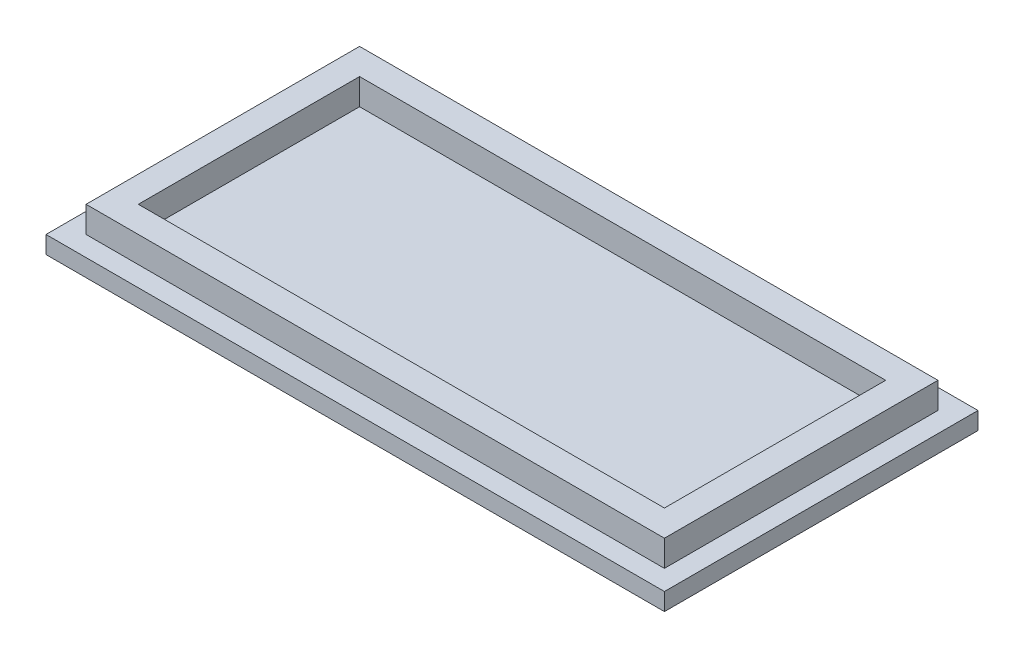
ISO-10303-21;
HEADER;
FILE_DESCRIPTION(('STEP AP214'),'2;1');
FILE_NAME('part.step','',(''),(''),'','','');
FILE_SCHEMA(('AUTOMOTIVE_DESIGN { 1 0 10303 214 1 1 1 1 }'));
ENDSEC;
DATA;
#1=APPLICATION_CONTEXT('core data for automotive mechanical design processes');
#2=APPLICATION_PROTOCOL_DEFINITION('international standard','automotive_design',2000,#1);
#3=PRODUCT_CONTEXT('',#1,'mechanical');
#4=PRODUCT('Part','Part','',(#3));
#5=PRODUCT_RELATED_PRODUCT_CATEGORY('part','',(#4));
#6=PRODUCT_DEFINITION_FORMATION('','',#4);
#7=PRODUCT_DEFINITION_CONTEXT('part definition',#1,'design');
#8=PRODUCT_DEFINITION('design','',#6,#7);
#9=PRODUCT_DEFINITION_SHAPE('','',#8);
#10=(LENGTH_UNIT() NAMED_UNIT(*) SI_UNIT(.MILLI.,.METRE.));
#11=(NAMED_UNIT(*) PLANE_ANGLE_UNIT() SI_UNIT($,.RADIAN.));
#12=(NAMED_UNIT(*) SI_UNIT($,.STERADIAN.) SOLID_ANGLE_UNIT());
#13=UNCERTAINTY_MEASURE_WITH_UNIT(LENGTH_MEASURE(1.E-05),#10,'distance_accuracy_value','');
#14=(GEOMETRIC_REPRESENTATION_CONTEXT(3) GLOBAL_UNCERTAINTY_ASSIGNED_CONTEXT((#13)) GLOBAL_UNIT_ASSIGNED_CONTEXT((#10,
#11,#12)) REPRESENTATION_CONTEXT('',''));
#15=CARTESIAN_POINT('',(0.,0.,0.));
#16=DIRECTION('',(0.,0.,1.));
#17=DIRECTION('',(1.,0.,0.));
#18=AXIS2_PLACEMENT_3D('',#15,#16,#17);
#19=CARTESIAN_POINT('',(0.,2.,0.));
#20=DIRECTION('',(0.,-1.,0.));
#21=DIRECTION('',(0.,0.,-1.));
#22=AXIS2_PLACEMENT_3D('',#19,#20,#21);
#23=PLANE('',#22);
#24=DIRECTION('',(0.,0.,-1.));
#25=VECTOR('',#24,1.);
#26=CARTESIAN_POINT('',(35.5,2.,18.));
#27=LINE('',#26,#25);
#28=CARTESIAN_POINT('',(35.5,2.,18.));
#29=VERTEX_POINT('',#28);
#30=CARTESIAN_POINT('',(35.5,2.,-18.));
#31=VERTEX_POINT('',#30);
#32=EDGE_CURVE('E203',#29,#31,#27,.T.);
#33=ORIENTED_EDGE('',*,*,#32,.T.);
#34=DIRECTION('',(-1.,0.,0.));
#35=VECTOR('',#34,1.);
#36=CARTESIAN_POINT('',(-35.5,2.,-18.));
#37=LINE('',#36,#35);
#38=CARTESIAN_POINT('',(-35.5,2.,-18.));
#39=VERTEX_POINT('',#38);
#40=EDGE_CURVE('E206',#31,#39,#37,.T.);
#41=ORIENTED_EDGE('',*,*,#40,.T.);
#42=DIRECTION('',(0.,0.,1.));
#43=VECTOR('',#42,1.);
#44=CARTESIAN_POINT('',(-35.5,2.,18.));
#45=LINE('',#44,#43);
#46=CARTESIAN_POINT('',(-35.5,2.,18.));
#47=VERTEX_POINT('',#46);
#48=EDGE_CURVE('E209',#39,#47,#45,.T.);
#49=ORIENTED_EDGE('',*,*,#48,.T.);
#50=DIRECTION('',(1.,0.,0.));
#51=VECTOR('',#50,1.);
#52=CARTESIAN_POINT('',(-35.5,2.,18.));
#53=LINE('',#52,#51);
#54=EDGE_CURVE('E211',#47,#29,#53,.T.);
#55=ORIENTED_EDGE('',*,*,#54,.T.);
#56=EDGE_LOOP('',(#33,#41,#49,#55));
#57=FACE_BOUND('',#56,.T.);
#58=DIRECTION('',(0.,0.,-1.));
#59=VECTOR('',#58,1.);
#60=CARTESIAN_POINT('',(33.2,2.,15.7));
#61=LINE('',#60,#59);
#62=CARTESIAN_POINT('',(33.2,2.,15.7));
#63=VERTEX_POINT('',#62);
#64=CARTESIAN_POINT('',(33.2,2.,-15.7));
#65=VERTEX_POINT('',#64);
#66=EDGE_CURVE('E62',#63,#65,#61,.T.);
#67=ORIENTED_EDGE('',*,*,#66,.F.);
#68=DIRECTION('',(1.,0.,0.));
#69=VECTOR('',#68,1.);
#70=CARTESIAN_POINT('',(-33.2,2.,15.7));
#71=LINE('',#70,#69);
#72=CARTESIAN_POINT('',(-33.2,2.,15.7));
#73=VERTEX_POINT('',#72);
#74=EDGE_CURVE('E176',#73,#63,#71,.T.);
#75=ORIENTED_EDGE('',*,*,#74,.F.);
#76=DIRECTION('',(0.,0.,1.));
#77=VECTOR('',#76,1.);
#78=CARTESIAN_POINT('',(-33.2,2.,15.7));
#79=LINE('',#78,#77);
#80=CARTESIAN_POINT('',(-33.2,2.,-15.7));
#81=VERTEX_POINT('',#80);
#82=EDGE_CURVE('E187',#81,#73,#79,.T.);
#83=ORIENTED_EDGE('',*,*,#82,.F.);
#84=DIRECTION('',(-1.,0.,0.));
#85=VECTOR('',#84,1.);
#86=CARTESIAN_POINT('',(-33.2,2.,-15.7));
#87=LINE('',#86,#85);
#88=EDGE_CURVE('E184',#65,#81,#87,.T.);
#89=ORIENTED_EDGE('',*,*,#88,.F.);
#90=EDGE_LOOP('',(#67,#75,#83,#89));
#91=FACE_BOUND('',#90,.T.);
#92=ADVANCED_FACE('F39',(#57,#91),#23,.F.);
#93=CARTESIAN_POINT('',(35.5,2.,18.));
#94=DIRECTION('',(-1.,0.,0.));
#95=DIRECTION('',(0.,0.,1.));
#96=AXIS2_PLACEMENT_3D('',#93,#94,#95);
#97=PLANE('',#96);
#98=DIRECTION('',(0.,0.,-1.));
#99=VECTOR('',#98,1.);
#100=CARTESIAN_POINT('',(35.5,0.,18.));
#101=LINE('',#100,#99);
#102=CARTESIAN_POINT('',(35.5,0.,18.));
#103=VERTEX_POINT('',#102);
#104=CARTESIAN_POINT('',(35.5,0.,-18.));
#105=VERTEX_POINT('',#104);
#106=EDGE_CURVE('E202',#103,#105,#101,.T.);
#107=ORIENTED_EDGE('',*,*,#106,.T.);
#108=DIRECTION('',(0.,-1.,0.));
#109=VECTOR('',#108,1.);
#110=CARTESIAN_POINT('',(35.5,2.,-18.));
#111=LINE('',#110,#109);
#112=EDGE_CURVE('E11',#31,#105,#111,.T.);
#113=ORIENTED_EDGE('',*,*,#112,.F.);
#114=ORIENTED_EDGE('',*,*,#32,.F.);
#115=DIRECTION('',(0.,-1.,0.));
#116=VECTOR('',#115,1.);
#117=CARTESIAN_POINT('',(35.5,2.,18.));
#118=LINE('',#117,#116);
#119=EDGE_CURVE('E213',#29,#103,#118,.T.);
#120=ORIENTED_EDGE('',*,*,#119,.T.);
#121=EDGE_LOOP('',(#107,#113,#114,#120));
#122=FACE_BOUND('',#121,.T.);
#123=ADVANCED_FACE('F41',(#122),#97,.F.);
#124=CARTESIAN_POINT('',(-35.5,2.,-18.));
#125=DIRECTION('',(0.,0.,1.));
#126=DIRECTION('',(1.,0.,0.));
#127=AXIS2_PLACEMENT_3D('',#124,#125,#126);
#128=PLANE('',#127);
#129=DIRECTION('',(-1.,0.,0.));
#130=VECTOR('',#129,1.);
#131=CARTESIAN_POINT('',(-35.5,0.,-18.));
#132=LINE('',#131,#130);
#133=CARTESIAN_POINT('',(-35.5,0.,-18.));
#134=VERTEX_POINT('',#133);
#135=EDGE_CURVE('E216',#105,#134,#132,.T.);
#136=ORIENTED_EDGE('',*,*,#135,.T.);
#137=DIRECTION('',(0.,-1.,0.));
#138=VECTOR('',#137,1.);
#139=CARTESIAN_POINT('',(-35.5,2.,-18.));
#140=LINE('',#139,#138);
#141=EDGE_CURVE('E47',#39,#134,#140,.T.);
#142=ORIENTED_EDGE('',*,*,#141,.F.);
#143=ORIENTED_EDGE('',*,*,#40,.F.);
#144=ORIENTED_EDGE('',*,*,#112,.T.);
#145=EDGE_LOOP('',(#136,#142,#143,#144));
#146=FACE_BOUND('',#145,.T.);
#147=ADVANCED_FACE('F245',(#146),#128,.F.);
#148=CARTESIAN_POINT('',(-35.5,2.,18.));
#149=DIRECTION('',(1.,0.,0.));
#150=DIRECTION('',(0.,0.,-1.));
#151=AXIS2_PLACEMENT_3D('',#148,#149,#150);
#152=PLANE('',#151);
#153=DIRECTION('',(0.,0.,1.));
#154=VECTOR('',#153,1.);
#155=CARTESIAN_POINT('',(-35.5,0.,18.));
#156=LINE('',#155,#154);
#157=CARTESIAN_POINT('',(-35.5,0.,18.));
#158=VERTEX_POINT('',#157);
#159=EDGE_CURVE('E218',#134,#158,#156,.T.);
#160=ORIENTED_EDGE('',*,*,#159,.T.);
#161=DIRECTION('',(0.,-1.,0.));
#162=VECTOR('',#161,1.);
#163=CARTESIAN_POINT('',(-35.5,2.,18.));
#164=LINE('',#163,#162);
#165=EDGE_CURVE('E223',#47,#158,#164,.T.);
#166=ORIENTED_EDGE('',*,*,#165,.F.);
#167=ORIENTED_EDGE('',*,*,#48,.F.);
#168=ORIENTED_EDGE('',*,*,#141,.T.);
#169=EDGE_LOOP('',(#160,#166,#167,#168));
#170=FACE_BOUND('',#169,.T.);
#171=ADVANCED_FACE('F230',(#170),#152,.F.);
#172=CARTESIAN_POINT('',(-35.5,2.,18.));
#173=DIRECTION('',(0.,0.,-1.));
#174=DIRECTION('',(-1.,0.,0.));
#175=AXIS2_PLACEMENT_3D('',#172,#173,#174);
#176=PLANE('',#175);
#177=DIRECTION('',(1.,0.,0.));
#178=VECTOR('',#177,1.);
#179=CARTESIAN_POINT('',(-35.5,0.,18.));
#180=LINE('',#179,#178);
#181=EDGE_CURVE('E207',#158,#103,#180,.T.);
#182=ORIENTED_EDGE('',*,*,#181,.T.);
#183=ORIENTED_EDGE('',*,*,#119,.F.);
#184=ORIENTED_EDGE('',*,*,#54,.F.);
#185=ORIENTED_EDGE('',*,*,#165,.T.);
#186=EDGE_LOOP('',(#182,#183,#184,#185));
#187=FACE_BOUND('',#186,.T.);
#188=ADVANCED_FACE('F239',(#187),#176,.F.);
#189=CARTESIAN_POINT('',(0.,0.,0.));
#190=DIRECTION('',(0.,-1.,0.));
#191=DIRECTION('',(0.,0.,-1.));
#192=AXIS2_PLACEMENT_3D('',#189,#190,#191);
#193=PLANE('',#192);
#194=CARTESIAN_POINT('',(0.,0.,0.));
#195=DIRECTION('',(0.,-1.,0.));
#196=DIRECTION('',(0.,0.,-1.));
#197=AXIS2_PLACEMENT_3D('',#194,#195,#196);
#198=CIRCLE('',#197,5.);
#199=CARTESIAN_POINT('',(0.,0.,-5.));
#200=VERTEX_POINT('',#199);
#201=EDGE_CURVE('E163',#200,#200,#198,.T.);
#202=ORIENTED_EDGE('',*,*,#201,.F.);
#203=EDGE_LOOP('',(#202));
#204=FACE_BOUND('',#203,.T.);
#205=ORIENTED_EDGE('',*,*,#106,.F.);
#206=ORIENTED_EDGE('',*,*,#181,.F.);
#207=ORIENTED_EDGE('',*,*,#159,.F.);
#208=ORIENTED_EDGE('',*,*,#135,.F.);
#209=EDGE_LOOP('',(#205,#206,#207,#208));
#210=FACE_BOUND('',#209,.T.);
#211=ADVANCED_FACE('F236',(#204,#210),#193,.T.);
#212=CARTESIAN_POINT('',(33.2,5.,15.7));
#213=DIRECTION('',(-1.,0.,0.));
#214=DIRECTION('',(0.,0.,1.));
#215=AXIS2_PLACEMENT_3D('',#212,#213,#214);
#216=PLANE('',#215);
#217=ORIENTED_EDGE('',*,*,#66,.T.);
#218=DIRECTION('',(0.,-1.,0.));
#219=VECTOR('',#218,1.);
#220=CARTESIAN_POINT('',(33.2,5.,-15.7));
#221=LINE('',#220,#219);
#222=CARTESIAN_POINT('',(33.2,5.,-15.7));
#223=VERTEX_POINT('',#222);
#224=EDGE_CURVE('E199',#223,#65,#221,.T.);
#225=ORIENTED_EDGE('',*,*,#224,.F.);
#226=DIRECTION('',(0.,0.,-1.));
#227=VECTOR('',#226,1.);
#228=CARTESIAN_POINT('',(33.2,5.,15.7));
#229=LINE('',#228,#227);
#230=CARTESIAN_POINT('',(33.2,5.,15.7));
#231=VERTEX_POINT('',#230);
#232=EDGE_CURVE('E172',#231,#223,#229,.T.);
#233=ORIENTED_EDGE('',*,*,#232,.F.);
#234=DIRECTION('',(0.,-1.,0.));
#235=VECTOR('',#234,1.);
#236=CARTESIAN_POINT('',(33.2,5.,15.7));
#237=LINE('',#236,#235);
#238=EDGE_CURVE('E182',#231,#63,#237,.T.);
#239=ORIENTED_EDGE('',*,*,#238,.T.);
#240=EDGE_LOOP('',(#217,#225,#233,#239));
#241=FACE_BOUND('',#240,.T.);
#242=ADVANCED_FACE('F260',(#241),#216,.F.);
#243=CARTESIAN_POINT('',(-33.2,5.,-15.7));
#244=DIRECTION('',(0.,0.,1.));
#245=DIRECTION('',(1.,0.,0.));
#246=AXIS2_PLACEMENT_3D('',#243,#244,#245);
#247=PLANE('',#246);
#248=ORIENTED_EDGE('',*,*,#88,.T.);
#249=DIRECTION('',(0.,-1.,0.));
#250=VECTOR('',#249,1.);
#251=CARTESIAN_POINT('',(-33.2,5.,-15.7));
#252=LINE('',#251,#250);
#253=CARTESIAN_POINT('',(-33.2,5.,-15.7));
#254=VERTEX_POINT('',#253);
#255=EDGE_CURVE('E196',#254,#81,#252,.T.);
#256=ORIENTED_EDGE('',*,*,#255,.F.);
#257=DIRECTION('',(-1.,0.,0.));
#258=VECTOR('',#257,1.);
#259=CARTESIAN_POINT('',(-33.2,5.,-15.7));
#260=LINE('',#259,#258);
#261=EDGE_CURVE('E175',#223,#254,#260,.T.);
#262=ORIENTED_EDGE('',*,*,#261,.F.);
#263=ORIENTED_EDGE('',*,*,#224,.T.);
#264=EDGE_LOOP('',(#248,#256,#262,#263));
#265=FACE_BOUND('',#264,.T.);
#266=ADVANCED_FACE('F300',(#265),#247,.F.);
#267=CARTESIAN_POINT('',(-33.2,5.,15.7));
#268=DIRECTION('',(1.,0.,0.));
#269=DIRECTION('',(0.,0.,-1.));
#270=AXIS2_PLACEMENT_3D('',#267,#268,#269);
#271=PLANE('',#270);
#272=ORIENTED_EDGE('',*,*,#82,.T.);
#273=DIRECTION('',(0.,-1.,0.));
#274=VECTOR('',#273,1.);
#275=CARTESIAN_POINT('',(-33.2,5.,15.7));
#276=LINE('',#275,#274);
#277=CARTESIAN_POINT('',(-33.2,5.,15.7));
#278=VERTEX_POINT('',#277);
#279=EDGE_CURVE('E193',#278,#73,#276,.T.);
#280=ORIENTED_EDGE('',*,*,#279,.F.);
#281=DIRECTION('',(0.,0.,1.));
#282=VECTOR('',#281,1.);
#283=CARTESIAN_POINT('',(-33.2,5.,15.7));
#284=LINE('',#283,#282);
#285=EDGE_CURVE('E178',#254,#278,#284,.T.);
#286=ORIENTED_EDGE('',*,*,#285,.F.);
#287=ORIENTED_EDGE('',*,*,#255,.T.);
#288=EDGE_LOOP('',(#272,#280,#286,#287));
#289=FACE_BOUND('',#288,.T.);
#290=ADVANCED_FACE('F308',(#289),#271,.F.);
#291=CARTESIAN_POINT('',(-33.2,5.,15.7));
#292=DIRECTION('',(0.,0.,-1.));
#293=DIRECTION('',(-1.,0.,0.));
#294=AXIS2_PLACEMENT_3D('',#291,#292,#293);
#295=PLANE('',#294);
#296=ORIENTED_EDGE('',*,*,#74,.T.);
#297=ORIENTED_EDGE('',*,*,#238,.F.);
#298=DIRECTION('',(1.,0.,0.));
#299=VECTOR('',#298,1.);
#300=CARTESIAN_POINT('',(-33.2,5.,15.7));
#301=LINE('',#300,#299);
#302=EDGE_CURVE('E180',#278,#231,#301,.T.);
#303=ORIENTED_EDGE('',*,*,#302,.F.);
#304=ORIENTED_EDGE('',*,*,#279,.T.);
#305=EDGE_LOOP('',(#296,#297,#303,#304));
#306=FACE_BOUND('',#305,.T.);
#307=ADVANCED_FACE('F316',(#306),#295,.F.);
#308=CARTESIAN_POINT('',(0.,5.,0.));
#309=DIRECTION('',(0.,-1.,0.));
#310=DIRECTION('',(0.,0.,-1.));
#311=AXIS2_PLACEMENT_3D('',#308,#309,#310);
#312=PLANE('',#311);
#313=DIRECTION('',(-1.,0.,0.));
#314=VECTOR('',#313,1.);
#315=CARTESIAN_POINT('',(-30.2,5.,-12.7));
#316=LINE('',#315,#314);
#317=CARTESIAN_POINT('',(30.2,5.,-12.7));
#318=VERTEX_POINT('',#317);
#319=CARTESIAN_POINT('',(-30.2,5.,-12.7));
#320=VERTEX_POINT('',#319);
#321=EDGE_CURVE('E157',#318,#320,#316,.T.);
#322=ORIENTED_EDGE('',*,*,#321,.F.);
#323=DIRECTION('',(0.,0.,-1.));
#324=VECTOR('',#323,1.);
#325=CARTESIAN_POINT('',(30.2,5.,12.7));
#326=LINE('',#325,#324);
#327=CARTESIAN_POINT('',(30.2,5.,12.7));
#328=VERTEX_POINT('',#327);
#329=EDGE_CURVE('E54',#328,#318,#326,.T.);
#330=ORIENTED_EDGE('',*,*,#329,.F.);
#331=DIRECTION('',(1.,0.,0.));
#332=VECTOR('',#331,1.);
#333=CARTESIAN_POINT('',(-30.2,5.,12.7));
#334=LINE('',#333,#332);
#335=CARTESIAN_POINT('',(-30.2,5.,12.7));
#336=VERTEX_POINT('',#335);
#337=EDGE_CURVE('E148',#336,#328,#334,.T.);
#338=ORIENTED_EDGE('',*,*,#337,.F.);
#339=DIRECTION('',(0.,0.,1.));
#340=VECTOR('',#339,1.);
#341=CARTESIAN_POINT('',(-30.2,5.,12.7));
#342=LINE('',#341,#340);
#343=EDGE_CURVE('E151',#320,#336,#342,.T.);
#344=ORIENTED_EDGE('',*,*,#343,.F.);
#345=EDGE_LOOP('',(#322,#330,#338,#344));
#346=FACE_BOUND('',#345,.T.);
#347=ORIENTED_EDGE('',*,*,#232,.T.);
#348=ORIENTED_EDGE('',*,*,#261,.T.);
#349=ORIENTED_EDGE('',*,*,#285,.T.);
#350=ORIENTED_EDGE('',*,*,#302,.T.);
#351=EDGE_LOOP('',(#347,#348,#349,#350));
#352=FACE_BOUND('',#351,.T.);
#353=ADVANCED_FACE('F325',(#346,#352),#312,.F.);
#354=CARTESIAN_POINT('',(0.,-5.,0.));
#355=DIRECTION('',(0.,1.,0.));
#356=DIRECTION('',(0.,0.,1.));
#357=AXIS2_PLACEMENT_3D('',#354,#355,#356);
#358=CYLINDRICAL_SURFACE('',#357,5.);
#359=CARTESIAN_POINT('',(0.,-5.,0.));
#360=DIRECTION('',(0.,-1.,0.));
#361=DIRECTION('',(0.,0.,-1.));
#362=AXIS2_PLACEMENT_3D('',#359,#360,#361);
#363=CIRCLE('',#362,5.);
#364=CARTESIAN_POINT('',(0.,-5.,-5.));
#365=VERTEX_POINT('',#364);
#366=EDGE_CURVE('E167',#365,#365,#363,.T.);
#367=ORIENTED_EDGE('',*,*,#366,.F.);
#368=EDGE_LOOP('',(#367));
#369=FACE_BOUND('',#368,.T.);
#370=ORIENTED_EDGE('',*,*,#201,.T.);
#371=EDGE_LOOP('',(#370));
#372=FACE_BOUND('',#371,.T.);
#373=ADVANCED_FACE('F334',(#369,#372),#358,.T.);
#374=CARTESIAN_POINT('',(0.,-5.,0.));
#375=DIRECTION('',(0.,-1.,0.));
#376=DIRECTION('',(0.,0.,-1.));
#377=AXIS2_PLACEMENT_3D('',#374,#375,#376);
#378=PLANE('',#377);
#379=ORIENTED_EDGE('',*,*,#366,.T.);
#380=EDGE_LOOP('',(#379));
#381=FACE_BOUND('',#380,.T.);
#382=ADVANCED_FACE('F343',(#381),#378,.T.);
#383=CARTESIAN_POINT('',(30.2,2.,12.7));
#384=DIRECTION('',(1.,0.,0.));
#385=DIRECTION('',(0.,0.,-1.));
#386=AXIS2_PLACEMENT_3D('',#383,#384,#385);
#387=PLANE('',#386);
#388=ORIENTED_EDGE('',*,*,#329,.T.);
#389=DIRECTION('',(0.,1.,0.));
#390=VECTOR('',#389,1.);
#391=CARTESIAN_POINT('',(30.2,2.,-12.7));
#392=LINE('',#391,#390);
#393=CARTESIAN_POINT('',(30.2,2.,-12.7));
#394=VERTEX_POINT('',#393);
#395=EDGE_CURVE('E126',#394,#318,#392,.T.);
#396=ORIENTED_EDGE('',*,*,#395,.F.);
#397=DIRECTION('',(0.,0.,-1.));
#398=VECTOR('',#397,1.);
#399=CARTESIAN_POINT('',(30.2,2.,12.7));
#400=LINE('',#399,#398);
#401=CARTESIAN_POINT('',(30.2,2.,12.7));
#402=VERTEX_POINT('',#401);
#403=EDGE_CURVE('E130',#402,#394,#400,.T.);
#404=ORIENTED_EDGE('',*,*,#403,.F.);
#405=DIRECTION('',(0.,1.,0.));
#406=VECTOR('',#405,1.);
#407=CARTESIAN_POINT('',(30.2,2.,12.7));
#408=LINE('',#407,#406);
#409=EDGE_CURVE('E161',#402,#328,#408,.T.);
#410=ORIENTED_EDGE('',*,*,#409,.T.);
#411=EDGE_LOOP('',(#388,#396,#404,#410));
#412=FACE_BOUND('',#411,.T.);
#413=ADVANCED_FACE('F128',(#412),#387,.F.);
#414=CARTESIAN_POINT('',(-30.2,2.,12.7));
#415=DIRECTION('',(0.,0.,1.));
#416=DIRECTION('',(1.,0.,0.));
#417=AXIS2_PLACEMENT_3D('',#414,#415,#416);
#418=PLANE('',#417);
#419=ORIENTED_EDGE('',*,*,#337,.T.);
#420=ORIENTED_EDGE('',*,*,#409,.F.);
#421=DIRECTION('',(1.,0.,0.));
#422=VECTOR('',#421,1.);
#423=CARTESIAN_POINT('',(-30.2,2.,12.7));
#424=LINE('',#423,#422);
#425=CARTESIAN_POINT('',(-30.2,2.,12.7));
#426=VERTEX_POINT('',#425);
#427=EDGE_CURVE('E136',#426,#402,#424,.T.);
#428=ORIENTED_EDGE('',*,*,#427,.F.);
#429=DIRECTION('',(0.,1.,0.));
#430=VECTOR('',#429,1.);
#431=CARTESIAN_POINT('',(-30.2,2.,12.7));
#432=LINE('',#431,#430);
#433=EDGE_CURVE('E164',#426,#336,#432,.T.);
#434=ORIENTED_EDGE('',*,*,#433,.T.);
#435=EDGE_LOOP('',(#419,#420,#428,#434));
#436=FACE_BOUND('',#435,.T.);
#437=ADVANCED_FACE('F360',(#436),#418,.F.);
#438=CARTESIAN_POINT('',(-30.2,2.,12.7));
#439=DIRECTION('',(-1.,0.,0.));
#440=DIRECTION('',(0.,0.,1.));
#441=AXIS2_PLACEMENT_3D('',#438,#439,#440);
#442=PLANE('',#441);
#443=ORIENTED_EDGE('',*,*,#343,.T.);
#444=ORIENTED_EDGE('',*,*,#433,.F.);
#445=DIRECTION('',(0.,0.,1.));
#446=VECTOR('',#445,1.);
#447=CARTESIAN_POINT('',(-30.2,2.,12.7));
#448=LINE('',#447,#446);
#449=CARTESIAN_POINT('',(-30.2,2.,-12.7));
#450=VERTEX_POINT('',#449);
#451=EDGE_CURVE('E144',#450,#426,#448,.T.);
#452=ORIENTED_EDGE('',*,*,#451,.F.);
#453=DIRECTION('',(0.,1.,0.));
#454=VECTOR('',#453,1.);
#455=CARTESIAN_POINT('',(-30.2,2.,-12.7));
#456=LINE('',#455,#454);
#457=EDGE_CURVE('E135',#450,#320,#456,.T.);
#458=ORIENTED_EDGE('',*,*,#457,.T.);
#459=EDGE_LOOP('',(#443,#444,#452,#458));
#460=FACE_BOUND('',#459,.T.);
#461=ADVANCED_FACE('F368',(#460),#442,.F.);
#462=CARTESIAN_POINT('',(-30.2,2.,-12.7));
#463=DIRECTION('',(0.,0.,-1.));
#464=DIRECTION('',(-1.,0.,0.));
#465=AXIS2_PLACEMENT_3D('',#462,#463,#464);
#466=PLANE('',#465);
#467=ORIENTED_EDGE('',*,*,#321,.T.);
#468=ORIENTED_EDGE('',*,*,#457,.F.);
#469=DIRECTION('',(-1.,0.,0.));
#470=VECTOR('',#469,1.);
#471=CARTESIAN_POINT('',(-30.2,2.,-12.7));
#472=LINE('',#471,#470);
#473=EDGE_CURVE('E139',#394,#450,#472,.T.);
#474=ORIENTED_EDGE('',*,*,#473,.F.);
#475=ORIENTED_EDGE('',*,*,#395,.T.);
#476=EDGE_LOOP('',(#467,#468,#474,#475));
#477=FACE_BOUND('',#476,.T.);
#478=ADVANCED_FACE('F140',(#477),#466,.F.);
#479=CARTESIAN_POINT('',(0.,2.,0.));
#480=DIRECTION('',(0.,-1.,0.));
#481=DIRECTION('',(0.,0.,-1.));
#482=AXIS2_PLACEMENT_3D('',#479,#480,#481);
#483=PLANE('',#482);
#484=ORIENTED_EDGE('',*,*,#403,.T.);
#485=ORIENTED_EDGE('',*,*,#473,.T.);
#486=ORIENTED_EDGE('',*,*,#451,.T.);
#487=ORIENTED_EDGE('',*,*,#427,.T.);
#488=EDGE_LOOP('',(#484,#485,#486,#487));
#489=FACE_BOUND('',#488,.T.);
#490=ADVANCED_FACE('F146',(#489),#483,.F.);
#491=CLOSED_SHELL('',(#92,#123,#147,#171,#188,#211,#242,#266,#290,#307,#353,#373,#382,#413,#437,
#461,#478,#490));
#492=MANIFOLD_SOLID_BREP('B2',#491);
#493=ADVANCED_BREP_SHAPE_REPRESENTATION('',(#18,#492),#14);
#494=SHAPE_DEFINITION_REPRESENTATION(#9,#493);
ENDSEC;
END-ISO-10303-21;
